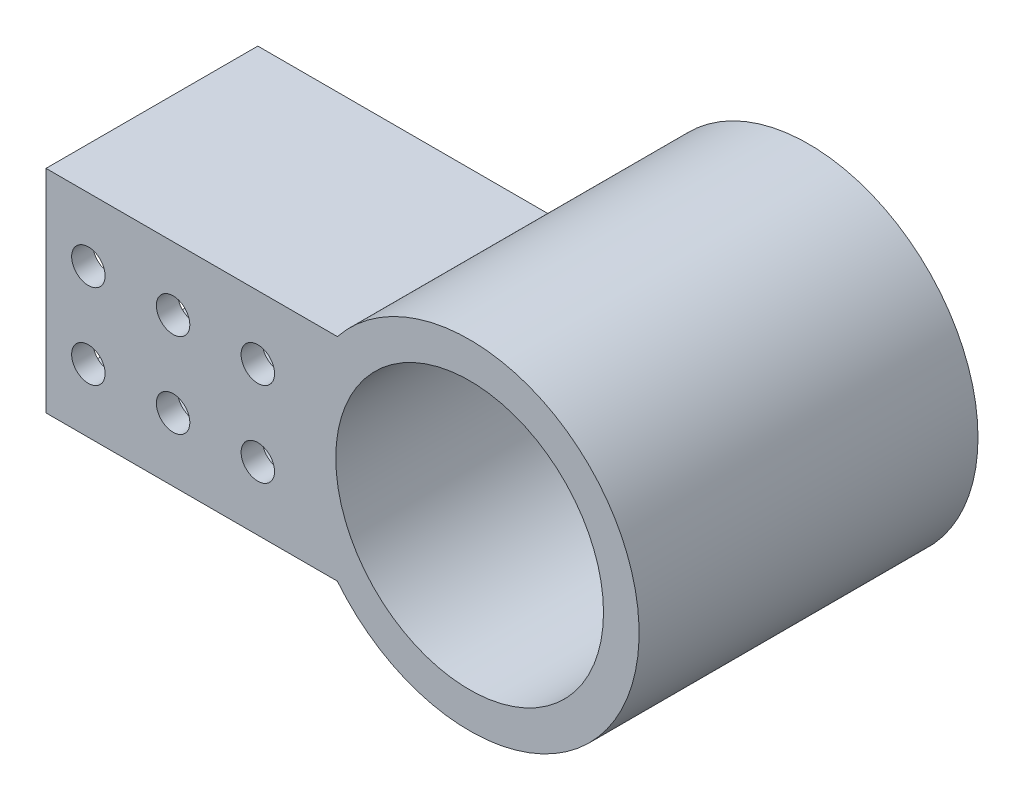
ISO-10303-21;
HEADER;
FILE_DESCRIPTION(('STEP AP214'),'2;1');
FILE_NAME('part.step','',(''),(''),'','','');
FILE_SCHEMA(('AUTOMOTIVE_DESIGN { 1 0 10303 214 1 1 1 1 }'));
ENDSEC;
DATA;
#1=APPLICATION_CONTEXT('core data for automotive mechanical design processes');
#2=APPLICATION_PROTOCOL_DEFINITION('international standard','automotive_design',2000,#1);
#3=PRODUCT_CONTEXT('',#1,'mechanical');
#4=PRODUCT('Part','Part','',(#3));
#5=PRODUCT_RELATED_PRODUCT_CATEGORY('part','',(#4));
#6=PRODUCT_DEFINITION_FORMATION('','',#4);
#7=PRODUCT_DEFINITION_CONTEXT('part definition',#1,'design');
#8=PRODUCT_DEFINITION('design','',#6,#7);
#9=PRODUCT_DEFINITION_SHAPE('','',#8);
#10=(LENGTH_UNIT() NAMED_UNIT(*) SI_UNIT(.MILLI.,.METRE.));
#11=(NAMED_UNIT(*) PLANE_ANGLE_UNIT() SI_UNIT($,.RADIAN.));
#12=(NAMED_UNIT(*) SI_UNIT($,.STERADIAN.) SOLID_ANGLE_UNIT());
#13=UNCERTAINTY_MEASURE_WITH_UNIT(LENGTH_MEASURE(1.E-05),#10,'distance_accuracy_value','');
#14=(GEOMETRIC_REPRESENTATION_CONTEXT(3) GLOBAL_UNCERTAINTY_ASSIGNED_CONTEXT((#13)) GLOBAL_UNIT_ASSIGNED_CONTEXT((#10,
#11,#12)) REPRESENTATION_CONTEXT('',''));
#15=CARTESIAN_POINT('',(0.,0.,0.));
#16=DIRECTION('',(0.,0.,1.));
#17=DIRECTION('',(1.,0.,0.));
#18=AXIS2_PLACEMENT_3D('',#15,#16,#17);
#19=CARTESIAN_POINT('',(-31.75,-6.35,19.05));
#20=DIRECTION('',(0.,0.,1.));
#21=DIRECTION('',(1.,0.,0.));
#22=AXIS2_PLACEMENT_3D('',#19,#20,#21);
#23=CYLINDRICAL_SURFACE('',#22,2.50825000000001);
#24=CARTESIAN_POINT('',(-31.75,-6.35,19.05));
#25=DIRECTION('',(0.,0.,1.));
#26=DIRECTION('',(1.,0.,0.));
#27=AXIS2_PLACEMENT_3D('',#24,#25,#26);
#28=CIRCLE('',#27,2.50825000000001);
#29=CARTESIAN_POINT('',(-29.24175,-6.35,19.05));
#30=VERTEX_POINT('',#29);
#31=EDGE_CURVE('E44',#30,#30,#28,.T.);
#32=ORIENTED_EDGE('',*,*,#31,.F.);
#33=EDGE_LOOP('',(#32));
#34=FACE_BOUND('',#33,.T.);
#35=CARTESIAN_POINT('',(-31.75,-6.35,22.225));
#36=DIRECTION('',(0.,0.,-1.));
#37=DIRECTION('',(-1.,0.,0.));
#38=AXIS2_PLACEMENT_3D('',#35,#36,#37);
#39=CIRCLE('',#38,2.50825000000001);
#40=CARTESIAN_POINT('',(-34.25825,-6.35,22.225));
#41=VERTEX_POINT('',#40);
#42=EDGE_CURVE('E11',#41,#41,#39,.T.);
#43=ORIENTED_EDGE('',*,*,#42,.F.);
#44=EDGE_LOOP('',(#43));
#45=FACE_BOUND('',#44,.T.);
#46=ADVANCED_FACE('F37',(#34,#45),#23,.F.);
#47=CARTESIAN_POINT('',(-31.75,6.35,19.05));
#48=DIRECTION('',(0.,0.,1.));
#49=DIRECTION('',(1.,0.,0.));
#50=AXIS2_PLACEMENT_3D('',#47,#48,#49);
#51=CYLINDRICAL_SURFACE('',#50,2.50825000000001);
#52=CARTESIAN_POINT('',(-31.75,6.35,50.8));
#53=DIRECTION('',(0.,0.,1.));
#54=DIRECTION('',(1.,0.,0.));
#55=AXIS2_PLACEMENT_3D('',#52,#53,#54);
#56=CIRCLE('',#55,2.50825000000001);
#57=CARTESIAN_POINT('',(-29.24175,6.35,50.8));
#58=VERTEX_POINT('',#57);
#59=EDGE_CURVE('E203',#58,#58,#56,.T.);
#60=ORIENTED_EDGE('',*,*,#59,.T.);
#61=EDGE_LOOP('',(#60));
#62=FACE_BOUND('',#61,.T.);
#63=CARTESIAN_POINT('',(-31.75,6.35,47.625));
#64=DIRECTION('',(0.,0.,1.));
#65=DIRECTION('',(0.,-1.,0.));
#66=AXIS2_PLACEMENT_3D('',#63,#64,#65);
#67=CIRCLE('',#66,2.50825000000001);
#68=CARTESIAN_POINT('',(-31.75,3.84175,47.625));
#69=VERTEX_POINT('',#68);
#70=EDGE_CURVE('E206',#69,#69,#67,.T.);
#71=ORIENTED_EDGE('',*,*,#70,.F.);
#72=EDGE_LOOP('',(#71));
#73=FACE_BOUND('',#72,.T.);
#74=ADVANCED_FACE('F215',(#62,#73),#51,.F.);
#75=CARTESIAN_POINT('',(-31.75,-6.35,19.05));
#76=DIRECTION('',(0.,0.,1.));
#77=DIRECTION('',(1.,0.,0.));
#78=AXIS2_PLACEMENT_3D('',#75,#76,#77);
#79=CYLINDRICAL_SURFACE('',#78,2.50825000000001);
#80=CARTESIAN_POINT('',(-31.75,-6.35,50.8));
#81=DIRECTION('',(0.,0.,1.));
#82=DIRECTION('',(1.,0.,0.));
#83=AXIS2_PLACEMENT_3D('',#80,#81,#82);
#84=CIRCLE('',#83,2.50825000000001);
#85=CARTESIAN_POINT('',(-29.24175,-6.35,50.8));
#86=VERTEX_POINT('',#85);
#87=EDGE_CURVE('E197',#86,#86,#84,.T.);
#88=ORIENTED_EDGE('',*,*,#87,.T.);
#89=EDGE_LOOP('',(#88));
#90=FACE_BOUND('',#89,.T.);
#91=CARTESIAN_POINT('',(-31.75,-6.35,47.625));
#92=DIRECTION('',(0.,0.,1.));
#93=DIRECTION('',(0.,-1.,0.));
#94=AXIS2_PLACEMENT_3D('',#91,#92,#93);
#95=CIRCLE('',#94,2.50825000000001);
#96=CARTESIAN_POINT('',(-31.75,-8.85825,47.625));
#97=VERTEX_POINT('',#96);
#98=EDGE_CURVE('E200',#97,#97,#95,.T.);
#99=ORIENTED_EDGE('',*,*,#98,.F.);
#100=EDGE_LOOP('',(#99));
#101=FACE_BOUND('',#100,.T.);
#102=ADVANCED_FACE('F267',(#90,#101),#79,.F.);
#103=CARTESIAN_POINT('',(-31.75,6.35,19.05));
#104=DIRECTION('',(0.,0.,1.));
#105=DIRECTION('',(1.,0.,0.));
#106=AXIS2_PLACEMENT_3D('',#103,#104,#105);
#107=CYLINDRICAL_SURFACE('',#106,2.50825000000001);
#108=CARTESIAN_POINT('',(-31.75,6.35,19.05));
#109=DIRECTION('',(0.,0.,1.));
#110=DIRECTION('',(1.,0.,0.));
#111=AXIS2_PLACEMENT_3D('',#108,#109,#110);
#112=CIRCLE('',#111,2.50825000000001);
#113=CARTESIAN_POINT('',(-29.24175,6.35,19.05));
#114=VERTEX_POINT('',#113);
#115=EDGE_CURVE('E181',#114,#114,#112,.T.);
#116=ORIENTED_EDGE('',*,*,#115,.F.);
#117=EDGE_LOOP('',(#116));
#118=FACE_BOUND('',#117,.T.);
#119=CARTESIAN_POINT('',(-31.75,6.35,22.225));
#120=DIRECTION('',(0.,0.,-1.));
#121=DIRECTION('',(-1.,0.,0.));
#122=AXIS2_PLACEMENT_3D('',#119,#120,#121);
#123=CIRCLE('',#122,2.50825000000001);
#124=CARTESIAN_POINT('',(-34.25825,6.35,22.225));
#125=VERTEX_POINT('',#124);
#126=EDGE_CURVE('E194',#125,#125,#123,.T.);
#127=ORIENTED_EDGE('',*,*,#126,.F.);
#128=EDGE_LOOP('',(#127));
#129=FACE_BOUND('',#128,.T.);
#130=ADVANCED_FACE('F257',(#118,#129),#107,.F.);
#131=CARTESIAN_POINT('',(0.,0.,50.8));
#132=DIRECTION('',(0.,0.,1.));
#133=DIRECTION('',(1.,0.,0.));
#134=AXIS2_PLACEMENT_3D('',#131,#132,#133);
#135=PLANE('',#134);
#136=CARTESIAN_POINT('',(-44.45,6.35,50.8));
#137=DIRECTION('',(0.,0.,1.));
#138=DIRECTION('',(1.,0.,0.));
#139=AXIS2_PLACEMENT_3D('',#136,#137,#138);
#140=CIRCLE('',#139,2.50825000000001);
#141=CARTESIAN_POINT('',(-41.94175,6.35,50.8));
#142=VERTEX_POINT('',#141);
#143=EDGE_CURVE('E322',#142,#142,#140,.T.);
#144=ORIENTED_EDGE('',*,*,#143,.F.);
#145=EDGE_LOOP('',(#144));
#146=FACE_BOUND('',#145,.T.);
#147=CARTESIAN_POINT('',(-44.45,-6.35,50.8));
#148=DIRECTION('',(0.,0.,1.));
#149=DIRECTION('',(1.,0.,0.));
#150=AXIS2_PLACEMENT_3D('',#147,#148,#149);
#151=CIRCLE('',#150,2.50825000000001);
#152=CARTESIAN_POINT('',(-41.94175,-6.35,50.8));
#153=VERTEX_POINT('',#152);
#154=EDGE_CURVE('E330',#153,#153,#151,.T.);
#155=ORIENTED_EDGE('',*,*,#154,.F.);
#156=EDGE_LOOP('',(#155));
#157=FACE_BOUND('',#156,.T.);
#158=CARTESIAN_POINT('',(-57.15,6.35,50.8));
#159=DIRECTION('',(0.,0.,1.));
#160=DIRECTION('',(1.,0.,0.));
#161=AXIS2_PLACEMENT_3D('',#158,#159,#160);
#162=CIRCLE('',#161,2.50825000000001);
#163=CARTESIAN_POINT('',(-54.64175,6.35,50.8));
#164=VERTEX_POINT('',#163);
#165=EDGE_CURVE('E345',#164,#164,#162,.T.);
#166=ORIENTED_EDGE('',*,*,#165,.F.);
#167=EDGE_LOOP('',(#166));
#168=FACE_BOUND('',#167,.T.);
#169=CARTESIAN_POINT('',(-57.15,-6.35,50.8));
#170=DIRECTION('',(0.,0.,1.));
#171=DIRECTION('',(1.,0.,0.));
#172=AXIS2_PLACEMENT_3D('',#169,#170,#171);
#173=CIRCLE('',#172,2.50825000000001);
#174=CARTESIAN_POINT('',(-54.64175,-6.35,50.8));
#175=VERTEX_POINT('',#174);
#176=EDGE_CURVE('E342',#175,#175,#173,.T.);
#177=ORIENTED_EDGE('',*,*,#176,.F.);
#178=EDGE_LOOP('',(#177));
#179=FACE_BOUND('',#178,.T.);
#180=CARTESIAN_POINT('',(0.,0.,50.8));
#181=DIRECTION('',(0.,0.,1.));
#182=DIRECTION('',(1.,0.,0.));
#183=AXIS2_PLACEMENT_3D('',#180,#181,#182);
#184=CIRCLE('',#183,25.4);
#185=CARTESIAN_POINT('',(-19.8278686449149,-15.875,50.8));
#186=VERTEX_POINT('',#185);
#187=CARTESIAN_POINT('',(-19.8278686449149,15.875,50.8));
#188=VERTEX_POINT('',#187);
#189=EDGE_CURVE('E179',#186,#188,#184,.T.);
#190=ORIENTED_EDGE('',*,*,#189,.T.);
#191=DIRECTION('',(-1.,0.,0.));
#192=VECTOR('',#191,1.);
#193=CARTESIAN_POINT('',(-19.8278686449149,15.875,50.8));
#194=LINE('',#193,#192);
#195=CARTESIAN_POINT('',(-63.5,15.875,50.8));
#196=VERTEX_POINT('',#195);
#197=EDGE_CURVE('E142',#188,#196,#194,.T.);
#198=ORIENTED_EDGE('',*,*,#197,.T.);
#199=DIRECTION('',(0.,-1.,0.));
#200=VECTOR('',#199,1.);
#201=CARTESIAN_POINT('',(-63.5,15.875,50.8));
#202=LINE('',#201,#200);
#203=CARTESIAN_POINT('',(-63.5,-15.875,50.8));
#204=VERTEX_POINT('',#203);
#205=EDGE_CURVE('E161',#196,#204,#202,.T.);
#206=ORIENTED_EDGE('',*,*,#205,.T.);
#207=DIRECTION('',(1.,0.,0.));
#208=VECTOR('',#207,1.);
#209=CARTESIAN_POINT('',(-19.8278686449149,-15.875,50.8));
#210=LINE('',#209,#208);
#211=EDGE_CURVE('E59',#204,#186,#210,.T.);
#212=ORIENTED_EDGE('',*,*,#211,.T.);
#213=EDGE_LOOP('',(#190,#198,#206,#212));
#214=FACE_BOUND('',#213,.T.);
#215=CARTESIAN_POINT('',(0.,0.,50.8));
#216=DIRECTION('',(0.,0.,1.));
#217=DIRECTION('',(1.,0.,0.));
#218=AXIS2_PLACEMENT_3D('',#215,#216,#217);
#219=CIRCLE('',#218,20.066);
#220=CARTESIAN_POINT('',(20.066,0.,50.8));
#221=VERTEX_POINT('',#220);
#222=EDGE_CURVE('E173',#221,#221,#219,.T.);
#223=ORIENTED_EDGE('',*,*,#222,.F.);
#224=EDGE_LOOP('',(#223));
#225=FACE_BOUND('',#224,.T.);
#226=ORIENTED_EDGE('',*,*,#87,.F.);
#227=EDGE_LOOP('',(#226));
#228=FACE_BOUND('',#227,.T.);
#229=ORIENTED_EDGE('',*,*,#59,.F.);
#230=EDGE_LOOP('',(#229));
#231=FACE_BOUND('',#230,.T.);
#232=ADVANCED_FACE('F253',(#146,#157,#168,#179,#214,#225,#228,#231),#135,.T.);
#233=CARTESIAN_POINT('',(0.,0.,0.));
#234=DIRECTION('',(0.,0.,1.));
#235=DIRECTION('',(1.,0.,0.));
#236=AXIS2_PLACEMENT_3D('',#233,#234,#235);
#237=PLANE('',#236);
#238=CARTESIAN_POINT('',(0.,0.,0.));
#239=DIRECTION('',(0.,0.,1.));
#240=DIRECTION('',(1.,0.,0.));
#241=AXIS2_PLACEMENT_3D('',#238,#239,#240);
#242=CIRCLE('',#241,25.4);
#243=CARTESIAN_POINT('',(25.4,0.,0.));
#244=VERTEX_POINT('',#243);
#245=EDGE_CURVE('E176',#244,#244,#242,.T.);
#246=ORIENTED_EDGE('',*,*,#245,.F.);
#247=EDGE_LOOP('',(#246));
#248=FACE_BOUND('',#247,.T.);
#249=CARTESIAN_POINT('',(0.,0.,0.));
#250=DIRECTION('',(0.,0.,1.));
#251=DIRECTION('',(1.,0.,0.));
#252=AXIS2_PLACEMENT_3D('',#249,#250,#251);
#253=CIRCLE('',#252,20.066);
#254=CARTESIAN_POINT('',(20.066,0.,0.));
#255=VERTEX_POINT('',#254);
#256=EDGE_CURVE('E166',#255,#255,#253,.T.);
#257=ORIENTED_EDGE('',*,*,#256,.T.);
#258=EDGE_LOOP('',(#257));
#259=FACE_BOUND('',#258,.T.);
#260=ADVANCED_FACE('F256',(#248,#259),#237,.F.);
#261=CARTESIAN_POINT('',(0.,0.,50.8));
#262=DIRECTION('',(0.,0.,-1.));
#263=DIRECTION('',(-1.,0.,0.));
#264=AXIS2_PLACEMENT_3D('',#261,#262,#263);
#265=CYLINDRICAL_SURFACE('',#264,25.4);
#266=ORIENTED_EDGE('',*,*,#189,.F.);
#267=DIRECTION('',(0.,0.,1.));
#268=VECTOR('',#267,1.);
#269=CARTESIAN_POINT('',(-19.8278686449149,-15.875,19.05));
#270=LINE('',#269,#268);
#271=CARTESIAN_POINT('',(-19.8278686449149,-15.875,19.05));
#272=VERTEX_POINT('',#271);
#273=EDGE_CURVE('E164',#272,#186,#270,.T.);
#274=ORIENTED_EDGE('',*,*,#273,.F.);
#275=CARTESIAN_POINT('',(0.,0.,19.05));
#276=DIRECTION('',(0.,0.,-1.));
#277=DIRECTION('',(1.,0.,0.));
#278=AXIS2_PLACEMENT_3D('',#275,#276,#277);
#279=CIRCLE('',#278,25.4);
#280=CARTESIAN_POINT('',(-19.8278686449149,15.875,19.05));
#281=VERTEX_POINT('',#280);
#282=EDGE_CURVE('E146',#272,#281,#279,.T.);
#283=ORIENTED_EDGE('',*,*,#282,.T.);
#284=DIRECTION('',(0.,0.,1.));
#285=VECTOR('',#284,1.);
#286=CARTESIAN_POINT('',(-19.8278686449149,15.875,19.05));
#287=LINE('',#286,#285);
#288=EDGE_CURVE('E158',#281,#188,#287,.T.);
#289=ORIENTED_EDGE('',*,*,#288,.T.);
#290=EDGE_LOOP('',(#266,#274,#283,#289));
#291=FACE_BOUND('',#290,.T.);
#292=ORIENTED_EDGE('',*,*,#245,.T.);
#293=EDGE_LOOP('',(#292));
#294=FACE_BOUND('',#293,.T.);
#295=ADVANCED_FACE('F251',(#291,#294),#265,.T.);
#296=CARTESIAN_POINT('',(0.,0.,50.8));
#297=DIRECTION('',(0.,0.,-1.));
#298=DIRECTION('',(-1.,0.,0.));
#299=AXIS2_PLACEMENT_3D('',#296,#297,#298);
#300=CYLINDRICAL_SURFACE('',#299,20.066);
#301=ORIENTED_EDGE('',*,*,#222,.T.);
#302=EDGE_LOOP('',(#301));
#303=FACE_BOUND('',#302,.T.);
#304=ORIENTED_EDGE('',*,*,#256,.F.);
#305=EDGE_LOOP('',(#304));
#306=FACE_BOUND('',#305,.T.);
#307=ADVANCED_FACE('F241',(#303,#306),#300,.F.);
#308=CARTESIAN_POINT('',(-19.8278686449149,-15.875,19.05));
#309=DIRECTION('',(0.,-1.,0.));
#310=DIRECTION('',(1.,0.,0.));
#311=AXIS2_PLACEMENT_3D('',#308,#309,#310);
#312=PLANE('',#311);
#313=ORIENTED_EDGE('',*,*,#211,.F.);
#314=DIRECTION('',(0.,0.,1.));
#315=VECTOR('',#314,1.);
#316=CARTESIAN_POINT('',(-63.5,-15.875,19.05));
#317=LINE('',#316,#315);
#318=CARTESIAN_POINT('',(-63.5,-15.875,19.05));
#319=VERTEX_POINT('',#318);
#320=EDGE_CURVE('E167',#319,#204,#317,.T.);
#321=ORIENTED_EDGE('',*,*,#320,.F.);
#322=DIRECTION('',(1.,0.,0.));
#323=VECTOR('',#322,1.);
#324=CARTESIAN_POINT('',(-19.8278686449149,-15.875,19.05));
#325=LINE('',#324,#323);
#326=EDGE_CURVE('E155',#319,#272,#325,.T.);
#327=ORIENTED_EDGE('',*,*,#326,.T.);
#328=ORIENTED_EDGE('',*,*,#273,.T.);
#329=EDGE_LOOP('',(#313,#321,#327,#328));
#330=FACE_BOUND('',#329,.T.);
#331=ADVANCED_FACE('F237',(#330),#312,.T.);
#332=CARTESIAN_POINT('',(-63.5,15.875,19.05));
#333=DIRECTION('',(-1.,0.,0.));
#334=DIRECTION('',(0.,0.,1.));
#335=AXIS2_PLACEMENT_3D('',#332,#333,#334);
#336=PLANE('',#335);
#337=DIRECTION('',(0.,-1.,0.));
#338=VECTOR('',#337,1.);
#339=CARTESIAN_POINT('',(-63.5,12.7,22.225));
#340=LINE('',#339,#338);
#341=CARTESIAN_POINT('',(-63.5,12.7,22.225));
#342=VERTEX_POINT('',#341);
#343=CARTESIAN_POINT('',(-63.5,-12.7,22.225));
#344=VERTEX_POINT('',#343);
#345=EDGE_CURVE('E51',#342,#344,#340,.T.);
#346=ORIENTED_EDGE('',*,*,#345,.F.);
#347=DIRECTION('',(0.,0.,-1.));
#348=VECTOR('',#347,1.);
#349=CARTESIAN_POINT('',(-63.5,12.7,22.225));
#350=LINE('',#349,#348);
#351=CARTESIAN_POINT('',(-63.5,12.7,47.625));
#352=VERTEX_POINT('',#351);
#353=EDGE_CURVE('E124',#352,#342,#350,.T.);
#354=ORIENTED_EDGE('',*,*,#353,.F.);
#355=DIRECTION('',(0.,1.,0.));
#356=VECTOR('',#355,1.);
#357=CARTESIAN_POINT('',(-63.5,12.7,47.625));
#358=LINE('',#357,#356);
#359=CARTESIAN_POINT('',(-63.5,-12.7,47.625));
#360=VERTEX_POINT('',#359);
#361=EDGE_CURVE('E127',#360,#352,#358,.T.);
#362=ORIENTED_EDGE('',*,*,#361,.F.);
#363=DIRECTION('',(0.,0.,1.));
#364=VECTOR('',#363,1.);
#365=CARTESIAN_POINT('',(-63.5,-12.7,22.225));
#366=LINE('',#365,#364);
#367=EDGE_CURVE('E136',#344,#360,#366,.T.);
#368=ORIENTED_EDGE('',*,*,#367,.F.);
#369=EDGE_LOOP('',(#346,#354,#362,#368));
#370=FACE_BOUND('',#369,.T.);
#371=ORIENTED_EDGE('',*,*,#205,.F.);
#372=DIRECTION('',(0.,0.,1.));
#373=VECTOR('',#372,1.);
#374=CARTESIAN_POINT('',(-63.5,15.875,19.05));
#375=LINE('',#374,#373);
#376=CARTESIAN_POINT('',(-63.5,15.875,19.05));
#377=VERTEX_POINT('',#376);
#378=EDGE_CURVE('E169',#377,#196,#375,.T.);
#379=ORIENTED_EDGE('',*,*,#378,.F.);
#380=DIRECTION('',(0.,-1.,0.));
#381=VECTOR('',#380,1.);
#382=CARTESIAN_POINT('',(-63.5,15.875,19.05));
#383=LINE('',#382,#381);
#384=EDGE_CURVE('E152',#377,#319,#383,.T.);
#385=ORIENTED_EDGE('',*,*,#384,.T.);
#386=ORIENTED_EDGE('',*,*,#320,.T.);
#387=EDGE_LOOP('',(#371,#379,#385,#386));
#388=FACE_BOUND('',#387,.T.);
#389=ADVANCED_FACE('F240',(#370,#388),#336,.T.);
#390=CARTESIAN_POINT('',(-19.8278686449149,15.875,19.05));
#391=DIRECTION('',(0.,1.,0.));
#392=DIRECTION('',(-1.,0.,0.));
#393=AXIS2_PLACEMENT_3D('',#390,#391,#392);
#394=PLANE('',#393);
#395=ORIENTED_EDGE('',*,*,#197,.F.);
#396=ORIENTED_EDGE('',*,*,#288,.F.);
#397=DIRECTION('',(-1.,0.,0.));
#398=VECTOR('',#397,1.);
#399=CARTESIAN_POINT('',(-19.8278686449149,15.875,19.05));
#400=LINE('',#399,#398);
#401=EDGE_CURVE('E149',#281,#377,#400,.T.);
#402=ORIENTED_EDGE('',*,*,#401,.T.);
#403=ORIENTED_EDGE('',*,*,#378,.T.);
#404=EDGE_LOOP('',(#395,#396,#402,#403));
#405=FACE_BOUND('',#404,.T.);
#406=ADVANCED_FACE('F229',(#405),#394,.T.);
#407=CARTESIAN_POINT('',(0.,0.,19.05));
#408=DIRECTION('',(0.,0.,1.));
#409=DIRECTION('',(1.,0.,0.));
#410=AXIS2_PLACEMENT_3D('',#407,#408,#409);
#411=PLANE('',#410);
#412=CARTESIAN_POINT('',(-44.45,-6.35,19.05));
#413=DIRECTION('',(0.,0.,1.));
#414=DIRECTION('',(1.,0.,0.));
#415=AXIS2_PLACEMENT_3D('',#412,#413,#414);
#416=CIRCLE('',#415,2.50825000000001);
#417=CARTESIAN_POINT('',(-41.94175,-6.35,19.05));
#418=VERTEX_POINT('',#417);
#419=EDGE_CURVE('E319',#418,#418,#416,.T.);
#420=ORIENTED_EDGE('',*,*,#419,.T.);
#421=EDGE_LOOP('',(#420));
#422=FACE_BOUND('',#421,.T.);
#423=CARTESIAN_POINT('',(-44.45,6.35,19.05));
#424=DIRECTION('',(0.,0.,1.));
#425=DIRECTION('',(1.,0.,0.));
#426=AXIS2_PLACEMENT_3D('',#423,#424,#425);
#427=CIRCLE('',#426,2.50825000000001);
#428=CARTESIAN_POINT('',(-41.94175,6.35,19.05));
#429=VERTEX_POINT('',#428);
#430=EDGE_CURVE('E336',#429,#429,#427,.T.);
#431=ORIENTED_EDGE('',*,*,#430,.T.);
#432=EDGE_LOOP('',(#431));
#433=FACE_BOUND('',#432,.T.);
#434=CARTESIAN_POINT('',(-57.15,6.35,19.05));
#435=DIRECTION('',(0.,0.,1.));
#436=DIRECTION('',(1.,0.,0.));
#437=AXIS2_PLACEMENT_3D('',#434,#435,#436);
#438=CIRCLE('',#437,2.50825000000001);
#439=CARTESIAN_POINT('',(-54.64175,6.35,19.05));
#440=VERTEX_POINT('',#439);
#441=EDGE_CURVE('E188',#440,#440,#438,.T.);
#442=ORIENTED_EDGE('',*,*,#441,.T.);
#443=EDGE_LOOP('',(#442));
#444=FACE_BOUND('',#443,.T.);
#445=CARTESIAN_POINT('',(-57.15,-6.35,19.05));
#446=DIRECTION('',(0.,0.,1.));
#447=DIRECTION('',(1.,0.,0.));
#448=AXIS2_PLACEMENT_3D('',#445,#446,#447);
#449=CIRCLE('',#448,2.50825000000001);
#450=CARTESIAN_POINT('',(-54.64175,-6.35,19.05));
#451=VERTEX_POINT('',#450);
#452=EDGE_CURVE('E348',#451,#451,#449,.T.);
#453=ORIENTED_EDGE('',*,*,#452,.T.);
#454=EDGE_LOOP('',(#453));
#455=FACE_BOUND('',#454,.T.);
#456=ORIENTED_EDGE('',*,*,#282,.F.);
#457=ORIENTED_EDGE('',*,*,#326,.F.);
#458=ORIENTED_EDGE('',*,*,#384,.F.);
#459=ORIENTED_EDGE('',*,*,#401,.F.);
#460=EDGE_LOOP('',(#456,#457,#458,#459));
#461=FACE_BOUND('',#460,.T.);
#462=ORIENTED_EDGE('',*,*,#115,.T.);
#463=EDGE_LOOP('',(#462));
#464=FACE_BOUND('',#463,.T.);
#465=ORIENTED_EDGE('',*,*,#31,.T.);
#466=EDGE_LOOP('',(#465));
#467=FACE_BOUND('',#466,.T.);
#468=ADVANCED_FACE('F211',(#422,#433,#444,#455,#461,#464,#467),#411,.F.);
#469=CARTESIAN_POINT('',(-25.4,12.7,22.225));
#470=DIRECTION('',(0.,0.,-1.));
#471=DIRECTION('',(-1.,0.,0.));
#472=AXIS2_PLACEMENT_3D('',#469,#470,#471);
#473=PLANE('',#472);
#474=CARTESIAN_POINT('',(-44.45,-6.35,22.225));
#475=DIRECTION('',(0.,0.,-1.));
#476=DIRECTION('',(-1.,0.,0.));
#477=AXIS2_PLACEMENT_3D('',#474,#475,#476);
#478=CIRCLE('',#477,2.50825000000001);
#479=CARTESIAN_POINT('',(-46.95825,-6.35,22.225));
#480=VERTEX_POINT('',#479);
#481=EDGE_CURVE('E321',#480,#480,#478,.T.);
#482=ORIENTED_EDGE('',*,*,#481,.T.);
#483=EDGE_LOOP('',(#482));
#484=FACE_BOUND('',#483,.T.);
#485=CARTESIAN_POINT('',(-44.45,6.35,22.225));
#486=DIRECTION('',(0.,0.,-1.));
#487=DIRECTION('',(-1.,0.,0.));
#488=AXIS2_PLACEMENT_3D('',#485,#486,#487);
#489=CIRCLE('',#488,2.50825000000001);
#490=CARTESIAN_POINT('',(-46.95825,6.35,22.225));
#491=VERTEX_POINT('',#490);
#492=EDGE_CURVE('E339',#491,#491,#489,.T.);
#493=ORIENTED_EDGE('',*,*,#492,.T.);
#494=EDGE_LOOP('',(#493));
#495=FACE_BOUND('',#494,.T.);
#496=CARTESIAN_POINT('',(-57.15,6.35,22.225));
#497=DIRECTION('',(0.,0.,-1.));
#498=DIRECTION('',(-1.,0.,0.));
#499=AXIS2_PLACEMENT_3D('',#496,#497,#498);
#500=CIRCLE('',#499,2.50825000000001);
#501=CARTESIAN_POINT('',(-59.65825,6.35,22.225));
#502=VERTEX_POINT('',#501);
#503=EDGE_CURVE('E130',#502,#502,#500,.T.);
#504=ORIENTED_EDGE('',*,*,#503,.T.);
#505=EDGE_LOOP('',(#504));
#506=FACE_BOUND('',#505,.T.);
#507=CARTESIAN_POINT('',(-57.15,-6.35,22.225));
#508=DIRECTION('',(0.,0.,-1.));
#509=DIRECTION('',(-1.,0.,0.));
#510=AXIS2_PLACEMENT_3D('',#507,#508,#509);
#511=CIRCLE('',#510,2.50825000000001);
#512=CARTESIAN_POINT('',(-59.65825,-6.35,22.225));
#513=VERTEX_POINT('',#512);
#514=EDGE_CURVE('E187',#513,#513,#511,.T.);
#515=ORIENTED_EDGE('',*,*,#514,.T.);
#516=EDGE_LOOP('',(#515));
#517=FACE_BOUND('',#516,.T.);
#518=ORIENTED_EDGE('',*,*,#345,.T.);
#519=DIRECTION('',(-1.,0.,0.));
#520=VECTOR('',#519,1.);
#521=CARTESIAN_POINT('',(-25.4,-12.7,22.225));
#522=LINE('',#521,#520);
#523=CARTESIAN_POINT('',(-25.4,-12.7,22.225));
#524=VERTEX_POINT('',#523);
#525=EDGE_CURVE('E101',#524,#344,#522,.T.);
#526=ORIENTED_EDGE('',*,*,#525,.F.);
#527=DIRECTION('',(0.,-1.,0.));
#528=VECTOR('',#527,1.);
#529=CARTESIAN_POINT('',(-25.4,12.7,22.225));
#530=LINE('',#529,#528);
#531=CARTESIAN_POINT('',(-25.4,12.7,22.225));
#532=VERTEX_POINT('',#531);
#533=EDGE_CURVE('E106',#532,#524,#530,.T.);
#534=ORIENTED_EDGE('',*,*,#533,.F.);
#535=DIRECTION('',(-1.,0.,0.));
#536=VECTOR('',#535,1.);
#537=CARTESIAN_POINT('',(-25.4,12.7,22.225));
#538=LINE('',#537,#536);
#539=EDGE_CURVE('E140',#532,#342,#538,.T.);
#540=ORIENTED_EDGE('',*,*,#539,.T.);
#541=EDGE_LOOP('',(#518,#526,#534,#540));
#542=FACE_BOUND('',#541,.T.);
#543=ORIENTED_EDGE('',*,*,#126,.T.);
#544=EDGE_LOOP('',(#543));
#545=FACE_BOUND('',#544,.T.);
#546=ORIENTED_EDGE('',*,*,#42,.T.);
#547=EDGE_LOOP('',(#546));
#548=FACE_BOUND('',#547,.T.);
#549=ADVANCED_FACE('F103',(#484,#495,#506,#517,#542,#545,#548),#473,.F.);
#550=CARTESIAN_POINT('',(-25.4,12.7,22.225));
#551=DIRECTION('',(0.,1.,0.));
#552=DIRECTION('',(0.,0.,1.));
#553=AXIS2_PLACEMENT_3D('',#550,#551,#552);
#554=PLANE('',#553);
#555=ORIENTED_EDGE('',*,*,#353,.T.);
#556=ORIENTED_EDGE('',*,*,#539,.F.);
#557=DIRECTION('',(0.,0.,-1.));
#558=VECTOR('',#557,1.);
#559=CARTESIAN_POINT('',(-25.4,12.7,22.225));
#560=LINE('',#559,#558);
#561=CARTESIAN_POINT('',(-25.4,12.7,47.625));
#562=VERTEX_POINT('',#561);
#563=EDGE_CURVE('E112',#562,#532,#560,.T.);
#564=ORIENTED_EDGE('',*,*,#563,.F.);
#565=DIRECTION('',(-1.,0.,0.));
#566=VECTOR('',#565,1.);
#567=CARTESIAN_POINT('',(-25.4,12.7,47.625));
#568=LINE('',#567,#566);
#569=EDGE_CURVE('E143',#562,#352,#568,.T.);
#570=ORIENTED_EDGE('',*,*,#569,.T.);
#571=EDGE_LOOP('',(#555,#556,#564,#570));
#572=FACE_BOUND('',#571,.T.);
#573=ADVANCED_FACE('F219',(#572),#554,.F.);
#574=CARTESIAN_POINT('',(-25.4,12.7,47.625));
#575=DIRECTION('',(0.,0.,1.));
#576=DIRECTION('',(0.,-1.,0.));
#577=AXIS2_PLACEMENT_3D('',#574,#575,#576);
#578=PLANE('',#577);
#579=CARTESIAN_POINT('',(-44.45,6.35,47.625));
#580=DIRECTION('',(0.,0.,1.));
#581=DIRECTION('',(0.,-1.,0.));
#582=AXIS2_PLACEMENT_3D('',#579,#580,#581);
#583=CIRCLE('',#582,2.50825000000001);
#584=CARTESIAN_POINT('',(-44.45,3.84175,47.625));
#585=VERTEX_POINT('',#584);
#586=EDGE_CURVE('E325',#585,#585,#583,.T.);
#587=ORIENTED_EDGE('',*,*,#586,.T.);
#588=EDGE_LOOP('',(#587));
#589=FACE_BOUND('',#588,.T.);
#590=CARTESIAN_POINT('',(-44.45,-6.35,47.625));
#591=DIRECTION('',(0.,0.,1.));
#592=DIRECTION('',(0.,-1.,0.));
#593=AXIS2_PLACEMENT_3D('',#590,#591,#592);
#594=CIRCLE('',#593,2.50825000000001);
#595=CARTESIAN_POINT('',(-44.45,-8.85825,47.625));
#596=VERTEX_POINT('',#595);
#597=EDGE_CURVE('E333',#596,#596,#594,.T.);
#598=ORIENTED_EDGE('',*,*,#597,.T.);
#599=EDGE_LOOP('',(#598));
#600=FACE_BOUND('',#599,.T.);
#601=CARTESIAN_POINT('',(-57.15,6.35,47.625));
#602=DIRECTION('',(0.,0.,1.));
#603=DIRECTION('',(0.,-1.,0.));
#604=AXIS2_PLACEMENT_3D('',#601,#602,#603);
#605=CIRCLE('',#604,2.50825000000001);
#606=CARTESIAN_POINT('',(-57.15,3.84174999999999,47.625));
#607=VERTEX_POINT('',#606);
#608=EDGE_CURVE('E189',#607,#607,#605,.T.);
#609=ORIENTED_EDGE('',*,*,#608,.T.);
#610=EDGE_LOOP('',(#609));
#611=FACE_BOUND('',#610,.T.);
#612=CARTESIAN_POINT('',(-57.15,-6.35,47.625));
#613=DIRECTION('',(0.,0.,1.));
#614=DIRECTION('',(0.,-1.,0.));
#615=AXIS2_PLACEMENT_3D('',#612,#613,#614);
#616=CIRCLE('',#615,2.50825000000001);
#617=CARTESIAN_POINT('',(-57.15,-8.85825000000001,47.625));
#618=VERTEX_POINT('',#617);
#619=EDGE_CURVE('E184',#618,#618,#616,.T.);
#620=ORIENTED_EDGE('',*,*,#619,.T.);
#621=EDGE_LOOP('',(#620));
#622=FACE_BOUND('',#621,.T.);
#623=ORIENTED_EDGE('',*,*,#361,.T.);
#624=ORIENTED_EDGE('',*,*,#569,.F.);
#625=DIRECTION('',(0.,1.,0.));
#626=VECTOR('',#625,1.);
#627=CARTESIAN_POINT('',(-25.4,12.7,47.625));
#628=LINE('',#627,#626);
#629=CARTESIAN_POINT('',(-25.4,-12.7,47.625));
#630=VERTEX_POINT('',#629);
#631=EDGE_CURVE('E120',#630,#562,#628,.T.);
#632=ORIENTED_EDGE('',*,*,#631,.F.);
#633=DIRECTION('',(-1.,0.,0.));
#634=VECTOR('',#633,1.);
#635=CARTESIAN_POINT('',(-25.4,-12.7,47.625));
#636=LINE('',#635,#634);
#637=EDGE_CURVE('E111',#630,#360,#636,.T.);
#638=ORIENTED_EDGE('',*,*,#637,.T.);
#639=EDGE_LOOP('',(#623,#624,#632,#638));
#640=FACE_BOUND('',#639,.T.);
#641=ORIENTED_EDGE('',*,*,#98,.T.);
#642=EDGE_LOOP('',(#641));
#643=FACE_BOUND('',#642,.T.);
#644=ORIENTED_EDGE('',*,*,#70,.T.);
#645=EDGE_LOOP('',(#644));
#646=FACE_BOUND('',#645,.T.);
#647=ADVANCED_FACE('F226',(#589,#600,#611,#622,#640,#643,#646),#578,.F.);
#648=CARTESIAN_POINT('',(-25.4,-12.7,22.225));
#649=DIRECTION('',(0.,-1.,0.));
#650=DIRECTION('',(0.,0.,-1.));
#651=AXIS2_PLACEMENT_3D('',#648,#649,#650);
#652=PLANE('',#651);
#653=ORIENTED_EDGE('',*,*,#367,.T.);
#654=ORIENTED_EDGE('',*,*,#637,.F.);
#655=DIRECTION('',(0.,0.,1.));
#656=VECTOR('',#655,1.);
#657=CARTESIAN_POINT('',(-25.4,-12.7,22.225));
#658=LINE('',#657,#656);
#659=EDGE_CURVE('E115',#524,#630,#658,.T.);
#660=ORIENTED_EDGE('',*,*,#659,.F.);
#661=ORIENTED_EDGE('',*,*,#525,.T.);
#662=EDGE_LOOP('',(#653,#654,#660,#661));
#663=FACE_BOUND('',#662,.T.);
#664=ADVANCED_FACE('F116',(#663),#652,.F.);
#665=CARTESIAN_POINT('',(-25.4,0.,0.));
#666=DIRECTION('',(-1.,0.,0.));
#667=DIRECTION('',(0.,0.,1.));
#668=AXIS2_PLACEMENT_3D('',#665,#666,#667);
#669=PLANE('',#668);
#670=ORIENTED_EDGE('',*,*,#533,.T.);
#671=ORIENTED_EDGE('',*,*,#659,.T.);
#672=ORIENTED_EDGE('',*,*,#631,.T.);
#673=ORIENTED_EDGE('',*,*,#563,.T.);
#674=EDGE_LOOP('',(#670,#671,#672,#673));
#675=FACE_BOUND('',#674,.T.);
#676=ADVANCED_FACE('F122',(#675),#669,.T.);
#677=CARTESIAN_POINT('',(-57.15,-6.35,19.05));
#678=DIRECTION('',(0.,0.,1.));
#679=DIRECTION('',(1.,0.,0.));
#680=AXIS2_PLACEMENT_3D('',#677,#678,#679);
#681=CYLINDRICAL_SURFACE('',#680,2.50825000000001);
#682=ORIENTED_EDGE('',*,*,#176,.T.);
#683=EDGE_LOOP('',(#682));
#684=FACE_BOUND('',#683,.T.);
#685=ORIENTED_EDGE('',*,*,#619,.F.);
#686=EDGE_LOOP('',(#685));
#687=FACE_BOUND('',#686,.T.);
#688=ADVANCED_FACE('F289',(#684,#687),#681,.F.);
#689=CARTESIAN_POINT('',(-57.15,6.35,19.05));
#690=DIRECTION('',(0.,0.,1.));
#691=DIRECTION('',(1.,0.,0.));
#692=AXIS2_PLACEMENT_3D('',#689,#690,#691);
#693=CYLINDRICAL_SURFACE('',#692,2.50825000000001);
#694=ORIENTED_EDGE('',*,*,#165,.T.);
#695=EDGE_LOOP('',(#694));
#696=FACE_BOUND('',#695,.T.);
#697=ORIENTED_EDGE('',*,*,#608,.F.);
#698=EDGE_LOOP('',(#697));
#699=FACE_BOUND('',#698,.T.);
#700=ADVANCED_FACE('F294',(#696,#699),#693,.F.);
#701=ORIENTED_EDGE('',*,*,#452,.F.);
#702=EDGE_LOOP('',(#701));
#703=FACE_BOUND('',#702,.T.);
#704=ORIENTED_EDGE('',*,*,#514,.F.);
#705=EDGE_LOOP('',(#704));
#706=FACE_BOUND('',#705,.T.);
#707=ADVANCED_FACE('F290',(#703,#706),#681,.F.);
#708=ORIENTED_EDGE('',*,*,#441,.F.);
#709=EDGE_LOOP('',(#708));
#710=FACE_BOUND('',#709,.T.);
#711=ORIENTED_EDGE('',*,*,#503,.F.);
#712=EDGE_LOOP('',(#711));
#713=FACE_BOUND('',#712,.T.);
#714=ADVANCED_FACE('F293',(#710,#713),#693,.F.);
#715=CARTESIAN_POINT('',(-44.45,6.35,19.05));
#716=DIRECTION('',(0.,0.,1.));
#717=DIRECTION('',(1.,0.,0.));
#718=AXIS2_PLACEMENT_3D('',#715,#716,#717);
#719=CYLINDRICAL_SURFACE('',#718,2.50825000000001);
#720=ORIENTED_EDGE('',*,*,#430,.F.);
#721=EDGE_LOOP('',(#720));
#722=FACE_BOUND('',#721,.T.);
#723=ORIENTED_EDGE('',*,*,#492,.F.);
#724=EDGE_LOOP('',(#723));
#725=FACE_BOUND('',#724,.T.);
#726=ADVANCED_FACE('F298',(#722,#725),#719,.F.);
#727=CARTESIAN_POINT('',(-44.45,-6.35,19.05));
#728=DIRECTION('',(0.,0.,1.));
#729=DIRECTION('',(1.,0.,0.));
#730=AXIS2_PLACEMENT_3D('',#727,#728,#729);
#731=CYLINDRICAL_SURFACE('',#730,2.50825000000001);
#732=ORIENTED_EDGE('',*,*,#154,.T.);
#733=EDGE_LOOP('',(#732));
#734=FACE_BOUND('',#733,.T.);
#735=ORIENTED_EDGE('',*,*,#597,.F.);
#736=EDGE_LOOP('',(#735));
#737=FACE_BOUND('',#736,.T.);
#738=ADVANCED_FACE('F302',(#734,#737),#731,.F.);
#739=CARTESIAN_POINT('',(-44.45,6.35,19.05));
#740=DIRECTION('',(0.,0.,1.));
#741=DIRECTION('',(1.,0.,0.));
#742=AXIS2_PLACEMENT_3D('',#739,#740,#741);
#743=CYLINDRICAL_SURFACE('',#742,2.50825000000001);
#744=ORIENTED_EDGE('',*,*,#143,.T.);
#745=EDGE_LOOP('',(#744));
#746=FACE_BOUND('',#745,.T.);
#747=ORIENTED_EDGE('',*,*,#586,.F.);
#748=EDGE_LOOP('',(#747));
#749=FACE_BOUND('',#748,.T.);
#750=ADVANCED_FACE('F306',(#746,#749),#743,.F.);
#751=CARTESIAN_POINT('',(-44.45,-6.35,19.05));
#752=DIRECTION('',(0.,0.,1.));
#753=DIRECTION('',(1.,0.,0.));
#754=AXIS2_PLACEMENT_3D('',#751,#752,#753);
#755=CYLINDRICAL_SURFACE('',#754,2.50825000000001);
#756=ORIENTED_EDGE('',*,*,#419,.F.);
#757=EDGE_LOOP('',(#756));
#758=FACE_BOUND('',#757,.T.);
#759=ORIENTED_EDGE('',*,*,#481,.F.);
#760=EDGE_LOOP('',(#759));
#761=FACE_BOUND('',#760,.T.);
#762=ADVANCED_FACE('F310',(#758,#761),#755,.F.);
#763=CLOSED_SHELL('',(#46,#74,#102,#130,#232,#260,#295,#307,#331,#389,#406,#468,#549,#573,#647,
#664,#676,#688,#700,#707,#714,#726,#738,#750,#762));
#764=MANIFOLD_SOLID_BREP('B2',#763);
#765=ADVANCED_BREP_SHAPE_REPRESENTATION('',(#18,#764),#14);
#766=SHAPE_DEFINITION_REPRESENTATION(#9,#765);
ENDSEC;
END-ISO-10303-21;
